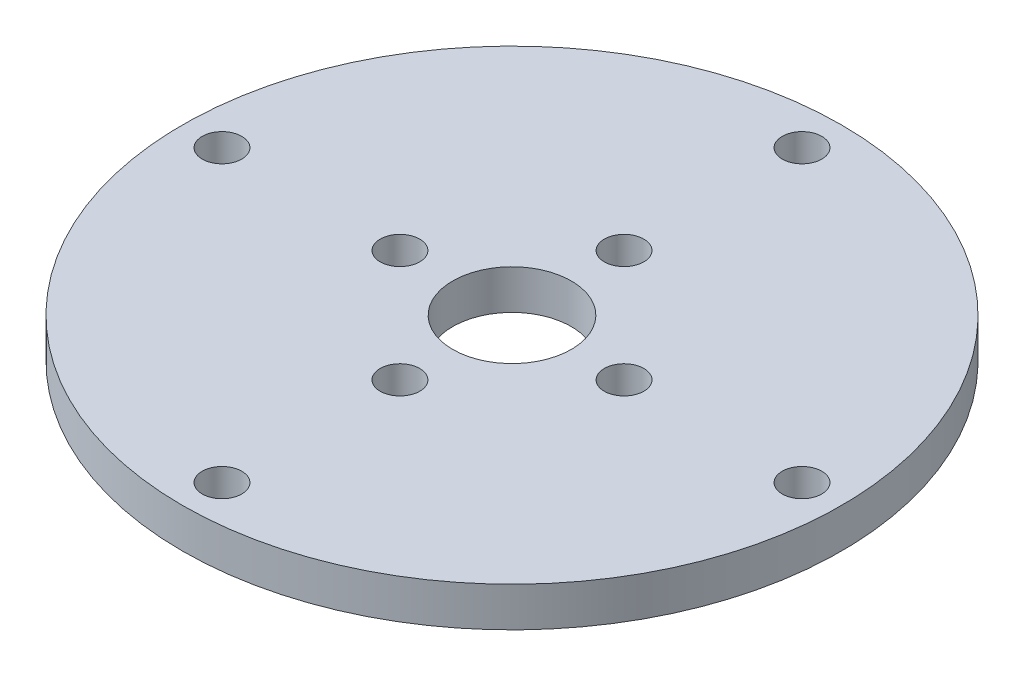
ISO-10303-21;
HEADER;
FILE_DESCRIPTION(('STEP AP214'),'2;1');
FILE_NAME('part.step','',(''),(''),'','','');
FILE_SCHEMA(('AUTOMOTIVE_DESIGN { 1 0 10303 214 1 1 1 1 }'));
ENDSEC;
DATA;
#1=APPLICATION_CONTEXT('core data for automotive mechanical design processes');
#2=APPLICATION_PROTOCOL_DEFINITION('international standard','automotive_design',2000,#1);
#3=PRODUCT_CONTEXT('',#1,'mechanical');
#4=PRODUCT('Part','Part','',(#3));
#5=PRODUCT_RELATED_PRODUCT_CATEGORY('part','',(#4));
#6=PRODUCT_DEFINITION_FORMATION('','',#4);
#7=PRODUCT_DEFINITION_CONTEXT('part definition',#1,'design');
#8=PRODUCT_DEFINITION('design','',#6,#7);
#9=PRODUCT_DEFINITION_SHAPE('','',#8);
#10=(LENGTH_UNIT() NAMED_UNIT(*) SI_UNIT(.MILLI.,.METRE.));
#11=(NAMED_UNIT(*) PLANE_ANGLE_UNIT() SI_UNIT($,.RADIAN.));
#12=(NAMED_UNIT(*) SI_UNIT($,.STERADIAN.) SOLID_ANGLE_UNIT());
#13=UNCERTAINTY_MEASURE_WITH_UNIT(LENGTH_MEASURE(1.E-05),#10,'distance_accuracy_value','');
#14=(GEOMETRIC_REPRESENTATION_CONTEXT(3) GLOBAL_UNCERTAINTY_ASSIGNED_CONTEXT((#13)) GLOBAL_UNIT_ASSIGNED_CONTEXT((#10,
#11,#12)) REPRESENTATION_CONTEXT('',''));
#15=CARTESIAN_POINT('',(0.,0.,0.));
#16=DIRECTION('',(0.,0.,1.));
#17=DIRECTION('',(1.,0.,0.));
#18=AXIS2_PLACEMENT_3D('',#15,#16,#17);
#19=CARTESIAN_POINT('',(0.,3.,0.));
#20=DIRECTION('',(0.,1.,0.));
#21=DIRECTION('',(0.,0.,1.));
#22=AXIS2_PLACEMENT_3D('',#19,#20,#21);
#23=PLANE('',#22);
#24=CARTESIAN_POINT('',(-22.,3.,0.));
#25=DIRECTION('',(0.,1.,0.));
#26=DIRECTION('',(1.,0.,0.));
#27=AXIS2_PLACEMENT_3D('',#24,#25,#26);
#28=CIRCLE('',#27,1.5);
#29=CARTESIAN_POINT('',(-20.5,3.,0.));
#30=VERTEX_POINT('',#29);
#31=EDGE_CURVE('E92',#30,#30,#28,.T.);
#32=ORIENTED_EDGE('',*,*,#31,.F.);
#33=EDGE_LOOP('',(#32));
#34=FACE_BOUND('',#33,.T.);
#35=CARTESIAN_POINT('',(0.,3.,22.));
#36=DIRECTION('',(0.,1.,0.));
#37=DIRECTION('',(0.,0.,-1.));
#38=AXIS2_PLACEMENT_3D('',#35,#36,#37);
#39=CIRCLE('',#38,1.5);
#40=CARTESIAN_POINT('',(0.,3.,20.5));
#41=VERTEX_POINT('',#40);
#42=EDGE_CURVE('E86',#41,#41,#39,.T.);
#43=ORIENTED_EDGE('',*,*,#42,.F.);
#44=EDGE_LOOP('',(#43));
#45=FACE_BOUND('',#44,.T.);
#46=CARTESIAN_POINT('',(22.,3.,-2.30437768363647E-13));
#47=DIRECTION('',(0.,1.,0.));
#48=DIRECTION('',(-1.,0.,0.));
#49=AXIS2_PLACEMENT_3D('',#46,#47,#48);
#50=CIRCLE('',#49,1.5);
#51=CARTESIAN_POINT('',(20.5,3.,-2.14726102338853E-13));
#52=VERTEX_POINT('',#51);
#53=EDGE_CURVE('E80',#52,#52,#50,.T.);
#54=ORIENTED_EDGE('',*,*,#53,.F.);
#55=EDGE_LOOP('',(#54));
#56=FACE_BOUND('',#55,.T.);
#57=CARTESIAN_POINT('',(0.,3.,-22.));
#58=DIRECTION('',(0.,1.,0.));
#59=DIRECTION('',(0.,0.,1.));
#60=AXIS2_PLACEMENT_3D('',#57,#58,#59);
#61=CIRCLE('',#60,1.5);
#62=CARTESIAN_POINT('',(0.,3.,-20.5));
#63=VERTEX_POINT('',#62);
#64=EDGE_CURVE('E74',#63,#63,#61,.T.);
#65=ORIENTED_EDGE('',*,*,#64,.F.);
#66=EDGE_LOOP('',(#65));
#67=FACE_BOUND('',#66,.T.);
#68=CARTESIAN_POINT('',(-8.5,3.,0.));
#69=DIRECTION('',(0.,1.,0.));
#70=DIRECTION('',(1.,0.,0.));
#71=AXIS2_PLACEMENT_3D('',#68,#69,#70);
#72=CIRCLE('',#71,1.5);
#73=CARTESIAN_POINT('',(-7.,3.,0.));
#74=VERTEX_POINT('',#73);
#75=EDGE_CURVE('E69',#74,#74,#72,.T.);
#76=ORIENTED_EDGE('',*,*,#75,.F.);
#77=EDGE_LOOP('',(#76));
#78=FACE_BOUND('',#77,.T.);
#79=CARTESIAN_POINT('',(0.,3.,8.5));
#80=DIRECTION('',(0.,1.,0.));
#81=DIRECTION('',(0.,0.,-1.));
#82=AXIS2_PLACEMENT_3D('',#79,#80,#81);
#83=CIRCLE('',#82,1.5);
#84=CARTESIAN_POINT('',(0.,3.,7.));
#85=VERTEX_POINT('',#84);
#86=EDGE_CURVE('E63',#85,#85,#83,.T.);
#87=ORIENTED_EDGE('',*,*,#86,.F.);
#88=EDGE_LOOP('',(#87));
#89=FACE_BOUND('',#88,.T.);
#90=CARTESIAN_POINT('',(8.5,3.,0.));
#91=DIRECTION('',(0.,1.,0.));
#92=DIRECTION('',(-1.,0.,0.));
#93=AXIS2_PLACEMENT_3D('',#90,#91,#92);
#94=CIRCLE('',#93,1.5);
#95=CARTESIAN_POINT('',(7.,3.,0.));
#96=VERTEX_POINT('',#95);
#97=EDGE_CURVE('E56',#96,#96,#94,.T.);
#98=ORIENTED_EDGE('',*,*,#97,.F.);
#99=EDGE_LOOP('',(#98));
#100=FACE_BOUND('',#99,.T.);
#101=CARTESIAN_POINT('',(0.,3.,-8.5));
#102=DIRECTION('',(0.,1.,0.));
#103=DIRECTION('',(0.,0.,1.));
#104=AXIS2_PLACEMENT_3D('',#101,#102,#103);
#105=CIRCLE('',#104,1.5);
#106=CARTESIAN_POINT('',(0.,3.,-7.));
#107=VERTEX_POINT('',#106);
#108=EDGE_CURVE('E50',#107,#107,#105,.T.);
#109=ORIENTED_EDGE('',*,*,#108,.F.);
#110=EDGE_LOOP('',(#109));
#111=FACE_BOUND('',#110,.T.);
#112=CARTESIAN_POINT('',(0.,3.,0.));
#113=DIRECTION('',(0.,1.,0.));
#114=DIRECTION('',(0.,0.,1.));
#115=AXIS2_PLACEMENT_3D('',#112,#113,#114);
#116=CIRCLE('',#115,25.);
#117=CARTESIAN_POINT('',(0.,3.,25.));
#118=VERTEX_POINT('',#117);
#119=EDGE_CURVE('E10',#118,#118,#116,.T.);
#120=ORIENTED_EDGE('',*,*,#119,.T.);
#121=EDGE_LOOP('',(#120));
#122=FACE_BOUND('',#121,.T.);
#123=CARTESIAN_POINT('',(0.,3.,0.));
#124=DIRECTION('',(0.,1.,0.));
#125=DIRECTION('',(0.,0.,1.));
#126=AXIS2_PLACEMENT_3D('',#123,#124,#125);
#127=CIRCLE('',#126,4.5);
#128=CARTESIAN_POINT('',(0.,3.,4.5));
#129=VERTEX_POINT('',#128);
#130=EDGE_CURVE('E42',#129,#129,#127,.T.);
#131=ORIENTED_EDGE('',*,*,#130,.F.);
#132=EDGE_LOOP('',(#131));
#133=FACE_BOUND('',#132,.T.);
#134=ADVANCED_FACE('F31',(#34,#45,#56,#67,#78,#89,#100,#111,#122,#133),#23,.T.);
#135=CARTESIAN_POINT('',(0.,0.,0.));
#136=DIRECTION('',(0.,1.,0.));
#137=DIRECTION('',(0.,0.,1.));
#138=AXIS2_PLACEMENT_3D('',#135,#136,#137);
#139=PLANE('',#138);
#140=CARTESIAN_POINT('',(-22.,0.,0.));
#141=DIRECTION('',(0.,1.,0.));
#142=DIRECTION('',(1.,0.,0.));
#143=AXIS2_PLACEMENT_3D('',#140,#141,#142);
#144=CIRCLE('',#143,1.5);
#145=CARTESIAN_POINT('',(-20.5,0.,0.));
#146=VERTEX_POINT('',#145);
#147=EDGE_CURVE('E77',#146,#146,#144,.T.);
#148=ORIENTED_EDGE('',*,*,#147,.T.);
#149=EDGE_LOOP('',(#148));
#150=FACE_BOUND('',#149,.T.);
#151=CARTESIAN_POINT('',(0.,0.,22.));
#152=DIRECTION('',(0.,1.,0.));
#153=DIRECTION('',(0.,0.,-1.));
#154=AXIS2_PLACEMENT_3D('',#151,#152,#153);
#155=CIRCLE('',#154,1.5);
#156=CARTESIAN_POINT('',(0.,0.,20.5));
#157=VERTEX_POINT('',#156);
#158=EDGE_CURVE('E89',#157,#157,#155,.T.);
#159=ORIENTED_EDGE('',*,*,#158,.T.);
#160=EDGE_LOOP('',(#159));
#161=FACE_BOUND('',#160,.T.);
#162=CARTESIAN_POINT('',(22.,0.,-2.30437768363647E-13));
#163=DIRECTION('',(0.,1.,0.));
#164=DIRECTION('',(-1.,0.,0.));
#165=AXIS2_PLACEMENT_3D('',#162,#163,#164);
#166=CIRCLE('',#165,1.5);
#167=CARTESIAN_POINT('',(20.5,0.,-2.14726102338853E-13));
#168=VERTEX_POINT('',#167);
#169=EDGE_CURVE('E83',#168,#168,#166,.T.);
#170=ORIENTED_EDGE('',*,*,#169,.T.);
#171=EDGE_LOOP('',(#170));
#172=FACE_BOUND('',#171,.T.);
#173=CARTESIAN_POINT('',(0.,0.,-22.));
#174=DIRECTION('',(0.,1.,0.));
#175=DIRECTION('',(0.,0.,1.));
#176=AXIS2_PLACEMENT_3D('',#173,#174,#175);
#177=CIRCLE('',#176,1.5);
#178=CARTESIAN_POINT('',(0.,0.,-20.5));
#179=VERTEX_POINT('',#178);
#180=EDGE_CURVE('E60',#179,#179,#177,.T.);
#181=ORIENTED_EDGE('',*,*,#180,.T.);
#182=EDGE_LOOP('',(#181));
#183=FACE_BOUND('',#182,.T.);
#184=CARTESIAN_POINT('',(-8.5,0.,0.));
#185=DIRECTION('',(0.,1.,0.));
#186=DIRECTION('',(1.,0.,0.));
#187=AXIS2_PLACEMENT_3D('',#184,#185,#186);
#188=CIRCLE('',#187,1.5);
#189=CARTESIAN_POINT('',(-7.,0.,0.));
#190=VERTEX_POINT('',#189);
#191=EDGE_CURVE('E53',#190,#190,#188,.T.);
#192=ORIENTED_EDGE('',*,*,#191,.T.);
#193=EDGE_LOOP('',(#192));
#194=FACE_BOUND('',#193,.T.);
#195=CARTESIAN_POINT('',(0.,0.,8.5));
#196=DIRECTION('',(0.,1.,0.));
#197=DIRECTION('',(0.,0.,-1.));
#198=AXIS2_PLACEMENT_3D('',#195,#196,#197);
#199=CIRCLE('',#198,1.5);
#200=CARTESIAN_POINT('',(0.,0.,7.));
#201=VERTEX_POINT('',#200);
#202=EDGE_CURVE('E66',#201,#201,#199,.T.);
#203=ORIENTED_EDGE('',*,*,#202,.T.);
#204=EDGE_LOOP('',(#203));
#205=FACE_BOUND('',#204,.T.);
#206=CARTESIAN_POINT('',(8.5,0.,0.));
#207=DIRECTION('',(0.,1.,0.));
#208=DIRECTION('',(-1.,0.,0.));
#209=AXIS2_PLACEMENT_3D('',#206,#207,#208);
#210=CIRCLE('',#209,1.5);
#211=CARTESIAN_POINT('',(7.,0.,0.));
#212=VERTEX_POINT('',#211);
#213=EDGE_CURVE('E59',#212,#212,#210,.T.);
#214=ORIENTED_EDGE('',*,*,#213,.T.);
#215=EDGE_LOOP('',(#214));
#216=FACE_BOUND('',#215,.T.);
#217=CARTESIAN_POINT('',(0.,0.,-8.5));
#218=DIRECTION('',(0.,1.,0.));
#219=DIRECTION('',(0.,0.,1.));
#220=AXIS2_PLACEMENT_3D('',#217,#218,#219);
#221=CIRCLE('',#220,1.5);
#222=CARTESIAN_POINT('',(0.,0.,-7.));
#223=VERTEX_POINT('',#222);
#224=EDGE_CURVE('E47',#223,#223,#221,.T.);
#225=ORIENTED_EDGE('',*,*,#224,.T.);
#226=EDGE_LOOP('',(#225));
#227=FACE_BOUND('',#226,.T.);
#228=CARTESIAN_POINT('',(0.,0.,0.));
#229=DIRECTION('',(0.,1.,0.));
#230=DIRECTION('',(0.,0.,1.));
#231=AXIS2_PLACEMENT_3D('',#228,#229,#230);
#232=CIRCLE('',#231,25.);
#233=CARTESIAN_POINT('',(0.,0.,25.));
#234=VERTEX_POINT('',#233);
#235=EDGE_CURVE('E35',#234,#234,#232,.T.);
#236=ORIENTED_EDGE('',*,*,#235,.F.);
#237=EDGE_LOOP('',(#236));
#238=FACE_BOUND('',#237,.T.);
#239=CARTESIAN_POINT('',(0.,0.,0.));
#240=DIRECTION('',(0.,1.,0.));
#241=DIRECTION('',(0.,0.,1.));
#242=AXIS2_PLACEMENT_3D('',#239,#240,#241);
#243=CIRCLE('',#242,4.5);
#244=CARTESIAN_POINT('',(0.,0.,4.5));
#245=VERTEX_POINT('',#244);
#246=EDGE_CURVE('E44',#245,#245,#243,.T.);
#247=ORIENTED_EDGE('',*,*,#246,.T.);
#248=EDGE_LOOP('',(#247));
#249=FACE_BOUND('',#248,.T.);
#250=ADVANCED_FACE('F98',(#150,#161,#172,#183,#194,#205,#216,#227,#238,#249),#139,.F.);
#251=CARTESIAN_POINT('',(0.,3.,0.));
#252=DIRECTION('',(0.,-1.,0.));
#253=DIRECTION('',(0.,0.,-1.));
#254=AXIS2_PLACEMENT_3D('',#251,#252,#253);
#255=CYLINDRICAL_SURFACE('',#254,25.);
#256=ORIENTED_EDGE('',*,*,#119,.F.);
#257=EDGE_LOOP('',(#256));
#258=FACE_BOUND('',#257,.T.);
#259=ORIENTED_EDGE('',*,*,#235,.T.);
#260=EDGE_LOOP('',(#259));
#261=FACE_BOUND('',#260,.T.);
#262=ADVANCED_FACE('F33',(#258,#261),#255,.T.);
#263=CARTESIAN_POINT('',(0.,3.,0.));
#264=DIRECTION('',(0.,-1.,0.));
#265=DIRECTION('',(0.,0.,-1.));
#266=AXIS2_PLACEMENT_3D('',#263,#264,#265);
#267=CYLINDRICAL_SURFACE('',#266,4.5);
#268=ORIENTED_EDGE('',*,*,#130,.T.);
#269=EDGE_LOOP('',(#268));
#270=FACE_BOUND('',#269,.T.);
#271=ORIENTED_EDGE('',*,*,#246,.F.);
#272=EDGE_LOOP('',(#271));
#273=FACE_BOUND('',#272,.T.);
#274=ADVANCED_FACE('F127',(#270,#273),#267,.F.);
#275=CARTESIAN_POINT('',(0.,0.,-8.5));
#276=DIRECTION('',(0.,1.,0.));
#277=DIRECTION('',(0.,0.,1.));
#278=AXIS2_PLACEMENT_3D('',#275,#276,#277);
#279=CYLINDRICAL_SURFACE('',#278,1.5);
#280=ORIENTED_EDGE('',*,*,#224,.F.);
#281=EDGE_LOOP('',(#280));
#282=FACE_BOUND('',#281,.T.);
#283=ORIENTED_EDGE('',*,*,#108,.T.);
#284=EDGE_LOOP('',(#283));
#285=FACE_BOUND('',#284,.T.);
#286=ADVANCED_FACE('F130',(#282,#285),#279,.F.);
#287=CARTESIAN_POINT('',(8.5,0.,0.));
#288=DIRECTION('',(0.,1.,0.));
#289=DIRECTION('',(0.,0.,1.));
#290=AXIS2_PLACEMENT_3D('',#287,#288,#289);
#291=CYLINDRICAL_SURFACE('',#290,1.5);
#292=ORIENTED_EDGE('',*,*,#213,.F.);
#293=EDGE_LOOP('',(#292));
#294=FACE_BOUND('',#293,.T.);
#295=ORIENTED_EDGE('',*,*,#97,.T.);
#296=EDGE_LOOP('',(#295));
#297=FACE_BOUND('',#296,.T.);
#298=ADVANCED_FACE('F142',(#294,#297),#291,.F.);
#299=CARTESIAN_POINT('',(0.,0.,8.5));
#300=DIRECTION('',(0.,1.,0.));
#301=DIRECTION('',(0.,0.,1.));
#302=AXIS2_PLACEMENT_3D('',#299,#300,#301);
#303=CYLINDRICAL_SURFACE('',#302,1.5);
#304=ORIENTED_EDGE('',*,*,#202,.F.);
#305=EDGE_LOOP('',(#304));
#306=FACE_BOUND('',#305,.T.);
#307=ORIENTED_EDGE('',*,*,#86,.T.);
#308=EDGE_LOOP('',(#307));
#309=FACE_BOUND('',#308,.T.);
#310=ADVANCED_FACE('F146',(#306,#309),#303,.F.);
#311=CARTESIAN_POINT('',(-8.5,0.,0.));
#312=DIRECTION('',(0.,1.,0.));
#313=DIRECTION('',(0.,0.,1.));
#314=AXIS2_PLACEMENT_3D('',#311,#312,#313);
#315=CYLINDRICAL_SURFACE('',#314,1.5);
#316=ORIENTED_EDGE('',*,*,#191,.F.);
#317=EDGE_LOOP('',(#316));
#318=FACE_BOUND('',#317,.T.);
#319=ORIENTED_EDGE('',*,*,#75,.T.);
#320=EDGE_LOOP('',(#319));
#321=FACE_BOUND('',#320,.T.);
#322=ADVANCED_FACE('F150',(#318,#321),#315,.F.);
#323=CARTESIAN_POINT('',(0.,0.,-22.));
#324=DIRECTION('',(0.,1.,0.));
#325=DIRECTION('',(0.,0.,1.));
#326=AXIS2_PLACEMENT_3D('',#323,#324,#325);
#327=CYLINDRICAL_SURFACE('',#326,1.5);
#328=ORIENTED_EDGE('',*,*,#180,.F.);
#329=EDGE_LOOP('',(#328));
#330=FACE_BOUND('',#329,.T.);
#331=ORIENTED_EDGE('',*,*,#64,.T.);
#332=EDGE_LOOP('',(#331));
#333=FACE_BOUND('',#332,.T.);
#334=ADVANCED_FACE('F154',(#330,#333),#327,.F.);
#335=CARTESIAN_POINT('',(22.,0.,-2.30437768363647E-13));
#336=DIRECTION('',(0.,1.,0.));
#337=DIRECTION('',(0.,0.,1.));
#338=AXIS2_PLACEMENT_3D('',#335,#336,#337);
#339=CYLINDRICAL_SURFACE('',#338,1.5);
#340=ORIENTED_EDGE('',*,*,#169,.F.);
#341=EDGE_LOOP('',(#340));
#342=FACE_BOUND('',#341,.T.);
#343=ORIENTED_EDGE('',*,*,#53,.T.);
#344=EDGE_LOOP('',(#343));
#345=FACE_BOUND('',#344,.T.);
#346=ADVANCED_FACE('F158',(#342,#345),#339,.F.);
#347=CARTESIAN_POINT('',(0.,0.,22.));
#348=DIRECTION('',(0.,1.,0.));
#349=DIRECTION('',(0.,0.,1.));
#350=AXIS2_PLACEMENT_3D('',#347,#348,#349);
#351=CYLINDRICAL_SURFACE('',#350,1.5);
#352=ORIENTED_EDGE('',*,*,#158,.F.);
#353=EDGE_LOOP('',(#352));
#354=FACE_BOUND('',#353,.T.);
#355=ORIENTED_EDGE('',*,*,#42,.T.);
#356=EDGE_LOOP('',(#355));
#357=FACE_BOUND('',#356,.T.);
#358=ADVANCED_FACE('F104',(#354,#357),#351,.F.);
#359=CARTESIAN_POINT('',(-22.,0.,0.));
#360=DIRECTION('',(0.,1.,0.));
#361=DIRECTION('',(0.,0.,1.));
#362=AXIS2_PLACEMENT_3D('',#359,#360,#361);
#363=CYLINDRICAL_SURFACE('',#362,1.5);
#364=ORIENTED_EDGE('',*,*,#147,.F.);
#365=EDGE_LOOP('',(#364));
#366=FACE_BOUND('',#365,.T.);
#367=ORIENTED_EDGE('',*,*,#31,.T.);
#368=EDGE_LOOP('',(#367));
#369=FACE_BOUND('',#368,.T.);
#370=ADVANCED_FACE('F101',(#366,#369),#363,.F.);
#371=CLOSED_SHELL('',(#134,#250,#262,#274,#286,#298,#310,#322,#334,#346,#358,#370));
#372=MANIFOLD_SOLID_BREP('B2',#371);
#373=ADVANCED_BREP_SHAPE_REPRESENTATION('',(#18,#372),#14);
#374=SHAPE_DEFINITION_REPRESENTATION(#9,#373);
ENDSEC;
END-ISO-10303-21;
